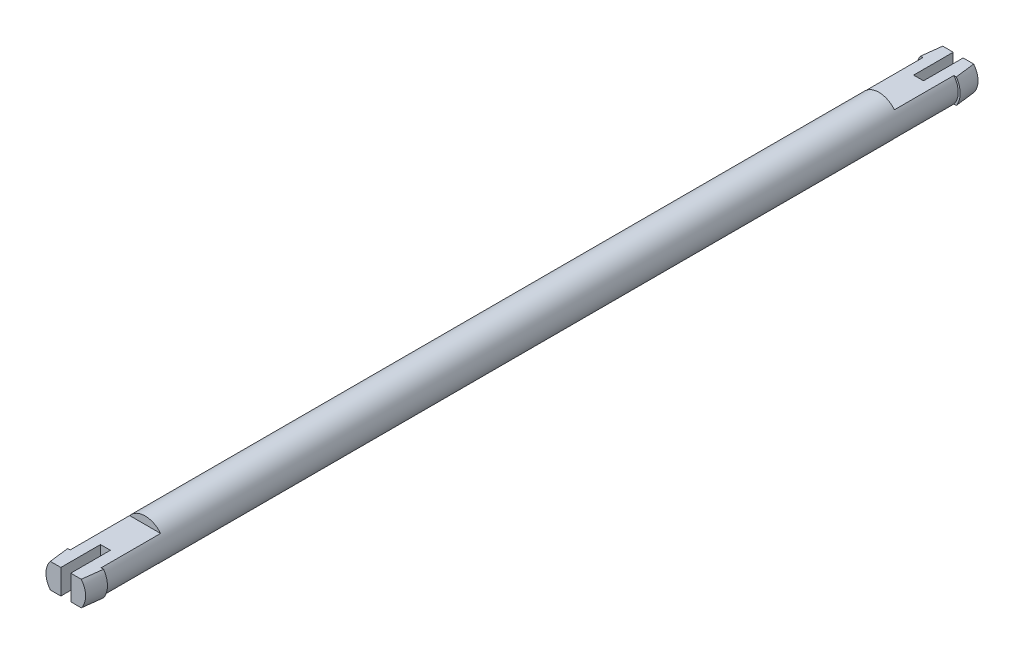
ISO-10303-21;
HEADER;
FILE_DESCRIPTION(('STEP AP214'),'2;1');
FILE_NAME('part.step','',(''),(''),'','','');
FILE_SCHEMA(('AUTOMOTIVE_DESIGN { 1 0 10303 214 1 1 1 1 }'));
ENDSEC;
DATA;
#1=APPLICATION_CONTEXT('core data for automotive mechanical design processes');
#2=APPLICATION_PROTOCOL_DEFINITION('international standard','automotive_design',2000,#1);
#3=PRODUCT_CONTEXT('',#1,'mechanical');
#4=PRODUCT('Part','Part','',(#3));
#5=PRODUCT_RELATED_PRODUCT_CATEGORY('part','',(#4));
#6=PRODUCT_DEFINITION_FORMATION('','',#4);
#7=PRODUCT_DEFINITION_CONTEXT('part definition',#1,'design');
#8=PRODUCT_DEFINITION('design','',#6,#7);
#9=PRODUCT_DEFINITION_SHAPE('','',#8);
#10=(LENGTH_UNIT() NAMED_UNIT(*) SI_UNIT(.MILLI.,.METRE.));
#11=(NAMED_UNIT(*) PLANE_ANGLE_UNIT() SI_UNIT($,.RADIAN.));
#12=(NAMED_UNIT(*) SI_UNIT($,.STERADIAN.) SOLID_ANGLE_UNIT());
#13=UNCERTAINTY_MEASURE_WITH_UNIT(LENGTH_MEASURE(1.E-05),#10,'distance_accuracy_value','');
#14=(GEOMETRIC_REPRESENTATION_CONTEXT(3) GLOBAL_UNCERTAINTY_ASSIGNED_CONTEXT((#13)) GLOBAL_UNIT_ASSIGNED_CONTEXT((#10,
#11,#12)) REPRESENTATION_CONTEXT('',''));
#15=CARTESIAN_POINT('',(0.,0.,0.));
#16=DIRECTION('',(0.,0.,1.));
#17=DIRECTION('',(1.,0.,0.));
#18=AXIS2_PLACEMENT_3D('',#15,#16,#17);
#19=CARTESIAN_POINT('',(0.,0.,-90.));
#20=DIRECTION('',(0.,0.,1.));
#21=DIRECTION('',(1.,0.,0.));
#22=AXIS2_PLACEMENT_3D('',#19,#20,#21);
#23=PLANE('',#22);
#24=DIRECTION('',(-1.,0.,0.));
#25=VECTOR('',#24,1.);
#26=CARTESIAN_POINT('',(0.,-1.25,-90.));
#27=LINE('',#26,#25);
#28=CARTESIAN_POINT('',(1.5612494995996,-1.25,-90.));
#29=VERTEX_POINT('',#28);
#30=CARTESIAN_POINT('',(0.499999999999999,-1.25,-90.));
#31=VERTEX_POINT('',#30);
#32=EDGE_CURVE('E213',#29,#31,#27,.T.);
#33=ORIENTED_EDGE('',*,*,#32,.T.);
#34=DIRECTION('',(0.,1.,0.));
#35=VECTOR('',#34,1.);
#36=CARTESIAN_POINT('',(0.499999999999999,-2.,-90.));
#37=LINE('',#36,#35);
#38=CARTESIAN_POINT('',(0.499999999999999,1.25,-90.));
#39=VERTEX_POINT('',#38);
#40=EDGE_CURVE('E199',#31,#39,#37,.T.);
#41=ORIENTED_EDGE('',*,*,#40,.T.);
#42=DIRECTION('',(1.,0.,0.));
#43=VECTOR('',#42,1.);
#44=CARTESIAN_POINT('',(0.,1.25,-90.));
#45=LINE('',#44,#43);
#46=CARTESIAN_POINT('',(1.5612494995996,1.25,-90.));
#47=VERTEX_POINT('',#46);
#48=EDGE_CURVE('E211',#39,#47,#45,.T.);
#49=ORIENTED_EDGE('',*,*,#48,.T.);
#50=CARTESIAN_POINT('',(0.,0.,-90.));
#51=DIRECTION('',(0.,0.,1.));
#52=DIRECTION('',(1.,0.,0.));
#53=AXIS2_PLACEMENT_3D('',#50,#51,#52);
#54=CIRCLE('',#53,2.);
#55=EDGE_CURVE('E416',#29,#47,#54,.T.);
#56=ORIENTED_EDGE('',*,*,#55,.F.);
#57=EDGE_LOOP('',(#33,#41,#49,#56));
#58=FACE_BOUND('',#57,.T.);
#59=ADVANCED_FACE('F34',(#58),#23,.F.);
#60=CARTESIAN_POINT('',(0.,0.,-88.));
#61=DIRECTION('',(0.,0.,1.));
#62=DIRECTION('',(1.,0.,0.));
#63=AXIS2_PLACEMENT_3D('',#60,#61,#62);
#64=PLANE('',#63);
#65=DIRECTION('',(-1.,0.,0.));
#66=VECTOR('',#65,1.);
#67=CARTESIAN_POINT('',(0.,-1.25,-88.));
#68=LINE('',#67,#66);
#69=CARTESIAN_POINT('',(1.81038669902327,-1.25,-88.0000000000001));
#70=VERTEX_POINT('',#69);
#71=CARTESIAN_POINT('',(1.5612494995996,-1.25,-88.));
#72=VERTEX_POINT('',#71);
#73=EDGE_CURVE('E261',#70,#72,#68,.T.);
#74=ORIENTED_EDGE('',*,*,#73,.F.);
#75=CARTESIAN_POINT('',(0.,0.,-88.));
#76=DIRECTION('',(0.,0.,1.));
#77=DIRECTION('',(1.,0.,0.));
#78=AXIS2_PLACEMENT_3D('',#75,#76,#77);
#79=CIRCLE('',#78,2.2);
#80=CARTESIAN_POINT('',(1.81038669902327,1.25,-88.0000000000001));
#81=VERTEX_POINT('',#80);
#82=EDGE_CURVE('E311',#70,#81,#79,.T.);
#83=ORIENTED_EDGE('',*,*,#82,.T.);
#84=DIRECTION('',(1.,0.,0.));
#85=VECTOR('',#84,1.);
#86=CARTESIAN_POINT('',(0.,1.25,-88.));
#87=LINE('',#86,#85);
#88=CARTESIAN_POINT('',(1.5612494995996,1.25,-88.));
#89=VERTEX_POINT('',#88);
#90=EDGE_CURVE('E294',#89,#81,#87,.T.);
#91=ORIENTED_EDGE('',*,*,#90,.F.);
#92=CARTESIAN_POINT('',(0.,0.,-88.));
#93=DIRECTION('',(0.,0.,1.));
#94=DIRECTION('',(1.,0.,0.));
#95=AXIS2_PLACEMENT_3D('',#92,#93,#94);
#96=CIRCLE('',#95,2.);
#97=EDGE_CURVE('E223',#89,#72,#96,.F.);
#98=ORIENTED_EDGE('',*,*,#97,.T.);
#99=EDGE_LOOP('',(#74,#83,#91,#98));
#100=FACE_BOUND('',#99,.T.);
#101=ADVANCED_FACE('F457',(#100),#64,.T.);
#102=CARTESIAN_POINT('',(0.,0.,-88.));
#103=DIRECTION('',(0.,0.,1.));
#104=DIRECTION('',(1.,0.,0.));
#105=AXIS2_PLACEMENT_3D('',#102,#103,#104);
#106=CONICAL_SURFACE('',#105,2.2,0.09966865249116);
#107=CARTESIAN_POINT('',(-2.07154781563105,-1.25,-85.8053511030935));
#108=CARTESIAN_POINT('',(-2.03550722726414,-1.25,-86.1139180179247));
#109=CARTESIAN_POINT('',(-1.99922295149764,-1.25,-86.4224563190549));
#110=CARTESIAN_POINT('',(-1.92607039278534,-1.25,-87.0394648246496));
#111=CARTESIAN_POINT('',(-1.88920210764817,-1.25,-87.3479350288541));
#112=CARTESIAN_POINT('',(-1.7775809143532,-1.25,-88.2731887554345));
#113=CARTESIAN_POINT('',(-1.70180760472734,-1.25,-88.889850372761));
#114=CARTESIAN_POINT('',(-1.58512147260779,-1.25,-89.8144760218349));
#115=CARTESIAN_POINT('',(-1.54572075887384,-1.25,-90.122630781761));
#116=CARTESIAN_POINT('',(-1.46564062998625,-1.25,-90.73877265943));
#117=CARTESIAN_POINT('',(-1.42496122188893,-1.25,-91.0467597780885));
#118=CARTESIAN_POINT('',(-1.34198072748193,-1.25,-91.6625339402322));
#119=CARTESIAN_POINT('',(-1.29967955336676,-1.25,-91.9703209719642));
#120=CARTESIAN_POINT('',(-1.21285635248197,-1.25,-92.5855868834585));
#121=CARTESIAN_POINT('',(-1.1683342833841,-1.25,-92.8930657572336));
#122=CARTESIAN_POINT('',(-1.12240193199715,-1.25,-93.2003390005902));
#123=B_SPLINE_CURVE_WITH_KNOTS('',3,(#107,#108,#109,#110,#111,#112,#113,#114,#115,#116,#117,
#118,#119,#120,#121,#122),.UNSPECIFIED.,.F.,.F.,(4,2,2,2,2,2,2,4),(0.,0.931993165762316,
1.86398982945298,3.72787750877082,4.65986577266914,5.59184889439996,6.52388254692389,
7.45593396996273),.UNSPECIFIED.);
#124=CARTESIAN_POINT('',(-1.81038669902327,-1.25,-88.0000000000001));
#125=VERTEX_POINT('',#124);
#126=CARTESIAN_POINT('',(-1.5612494995996,-1.25,-90.));
#127=VERTEX_POINT('',#126);
#128=EDGE_CURVE('E276',#125,#127,#123,.T.);
#129=ORIENTED_EDGE('',*,*,#128,.F.);
#130=CARTESIAN_POINT('',(-1.81038669902327,1.25,-88.0000000000001));
#131=VERTEX_POINT('',#130);
#132=EDGE_CURVE('E312',#131,#125,#79,.T.);
#133=ORIENTED_EDGE('',*,*,#132,.F.);
#134=CARTESIAN_POINT('',(-1.12240193199715,1.25,-93.2003390005902));
#135=CARTESIAN_POINT('',(-1.16007318188193,1.25,-92.9484550212629));
#136=CARTESIAN_POINT('',(-1.1967756822207,1.25,-92.6964288561933));
#137=CARTESIAN_POINT('',(-1.26860770564259,1.25,-92.1921552657798));
#138=CARTESIAN_POINT('',(-1.30373724824445,1.25,-91.9399078432212));
#139=CARTESIAN_POINT('',(-1.37278762127906,1.25,-91.4352571718187));
#140=CARTESIAN_POINT('',(-1.40670849276506,1.25,-91.1828539285641));
#141=CARTESIAN_POINT('',(-1.47357063225508,1.25,-90.6779171395039));
#142=CARTESIAN_POINT('',(-1.50651189747344,1.25,-90.4253835933298));
#143=CARTESIAN_POINT('',(-1.56766910496903,1.25,-89.9506559350624));
#144=CARTESIAN_POINT('',(-1.59597605442952,1.25,-89.7284735200067));
#145=CARTESIAN_POINT('',(-1.66291250795864,1.25,-89.1980433208731));
#146=CARTESIAN_POINT('',(-1.7012972858527,1.25,-88.8897646573885));
#147=CARTESIAN_POINT('',(-1.77723656698478,1.25,-88.2731045277542));
#148=CARTESIAN_POINT('',(-1.81479106820384,1.25,-87.9647230613564));
#149=CARTESIAN_POINT('',(-1.88921121609686,1.25,-87.3478817112025));
#150=CARTESIAN_POINT('',(-1.92607687286845,1.25,-87.0394218286632));
#151=CARTESIAN_POINT('',(-1.99922418459549,1.25,-86.4224342581659));
#152=CARTESIAN_POINT('',(-2.0355058422845,1.25,-86.1139065705321));
#153=CARTESIAN_POINT('',(-2.07154781563105,1.25,-85.8053511030935));
#154=B_SPLINE_CURVE_WITH_KNOTS('',3,(#134,#135,#136,#137,#138,#139,#140,#141,#142,#143,#144,
#145,#146,#147,#148,#149,#150,#151,#152,#153),.UNSPECIFIED.,.F.,.F.,(4,2,2,2,2,2,2,2,2,4),(0.,
0.764050536151596,1.5280915886214,2.2921066651918,3.05612391415671,3.72805834866274,
4.66003438385202,5.59201268506309,6.5239773138689,7.45593757911203),.UNSPECIFIED.);
#155=CARTESIAN_POINT('',(-1.5612494995996,1.25,-90.));
#156=VERTEX_POINT('',#155);
#157=EDGE_CURVE('E301',#156,#131,#154,.T.);
#158=ORIENTED_EDGE('',*,*,#157,.F.);
#159=EDGE_CURVE('E417',#156,#127,#54,.T.);
#160=ORIENTED_EDGE('',*,*,#159,.T.);
#161=EDGE_LOOP('',(#129,#133,#158,#160));
#162=FACE_BOUND('',#161,.T.);
#163=ADVANCED_FACE('F463',(#162),#106,.T.);
#164=CARTESIAN_POINT('',(0.,0.,0.));
#165=DIRECTION('',(0.,0.,1.));
#166=DIRECTION('',(1.,0.,0.));
#167=AXIS2_PLACEMENT_3D('',#164,#165,#166);
#168=PLANE('',#167);
#169=DIRECTION('',(0.,-1.,0.));
#170=VECTOR('',#169,1.);
#171=CARTESIAN_POINT('',(-0.5,2.001,0.));
#172=LINE('',#171,#170);
#173=CARTESIAN_POINT('',(-0.5,1.25,0.));
#174=VERTEX_POINT('',#173);
#175=CARTESIAN_POINT('',(-0.5,-1.25,0.));
#176=VERTEX_POINT('',#175);
#177=EDGE_CURVE('E328',#174,#176,#172,.T.);
#178=ORIENTED_EDGE('',*,*,#177,.F.);
#179=DIRECTION('',(1.,0.,0.));
#180=VECTOR('',#179,1.);
#181=CARTESIAN_POINT('',(0.,1.25,0.));
#182=LINE('',#181,#180);
#183=CARTESIAN_POINT('',(-1.5612494995996,1.25,0.));
#184=VERTEX_POINT('',#183);
#185=EDGE_CURVE('E431',#184,#174,#182,.T.);
#186=ORIENTED_EDGE('',*,*,#185,.F.);
#187=CARTESIAN_POINT('',(0.,0.,0.));
#188=DIRECTION('',(0.,0.,1.));
#189=DIRECTION('',(1.,0.,0.));
#190=AXIS2_PLACEMENT_3D('',#187,#188,#189);
#191=CIRCLE('',#190,2.);
#192=CARTESIAN_POINT('',(-1.5612494995996,-1.25,0.));
#193=VERTEX_POINT('',#192);
#194=EDGE_CURVE('E412',#184,#193,#191,.T.);
#195=ORIENTED_EDGE('',*,*,#194,.T.);
#196=DIRECTION('',(-1.,0.,0.));
#197=VECTOR('',#196,1.);
#198=CARTESIAN_POINT('',(0.,-1.25,0.));
#199=LINE('',#198,#197);
#200=EDGE_CURVE('E424',#176,#193,#199,.T.);
#201=ORIENTED_EDGE('',*,*,#200,.F.);
#202=EDGE_LOOP('',(#178,#186,#195,#201));
#203=FACE_BOUND('',#202,.T.);
#204=ADVANCED_FACE('F487',(#203),#168,.T.);
#205=CARTESIAN_POINT('',(0.,0.,0.));
#206=DIRECTION('',(0.,0.,-1.));
#207=DIRECTION('',(-1.,0.,0.));
#208=AXIS2_PLACEMENT_3D('',#205,#206,#207);
#209=CONICAL_SURFACE('',#208,2.,0.099668652491164);
#210=CARTESIAN_POINT('',(-2.20629085167545,1.25,-5.35787712366069));
#211=CARTESIAN_POINT('',(-2.16911364127437,1.25,-5.03442418142204));
#212=CARTESIAN_POINT('',(-2.13171451989949,1.25,-4.71099685663597));
#213=CARTESIAN_POINT('',(-2.05638780976398,1.25,-4.06420290953939));
#214=CARTESIAN_POINT('',(-2.01846021960566,1.25,-3.74083628739172));
#215=CARTESIAN_POINT('',(-1.9037610902439,1.25,-2.77086975377677));
#216=CARTESIAN_POINT('',(-1.82607027221003,1.25,-2.12437765306017));
#217=CARTESIAN_POINT('',(-1.70685435031514,1.25,-1.15495865945317));
#218=CARTESIAN_POINT('',(-1.6666684414073,1.25,-0.831867113806452));
#219=CARTESIAN_POINT('',(-1.58517894557185,1.25,-0.185825927060374));
#220=CARTESIAN_POINT('',(-1.54387536251855,1.25,0.13712371452694));
#221=CARTESIAN_POINT('',(-1.45986916908056,1.25,0.782854266012009));
#222=CARTESIAN_POINT('',(-1.41716650618306,1.25,1.10563516911334));
#223=CARTESIAN_POINT('',(-1.3298927063912,1.25,1.75094775860941));
#224=CARTESIAN_POINT('',(-1.28532154707355,1.25,2.07347944196601));
#225=CARTESIAN_POINT('',(-1.23958118370649,1.25,2.39584846975231));
#226=B_SPLINE_CURVE_WITH_KNOTS('',3,(#210,#211,#212,#213,#214,#215,#216,#217,#218,#219,#220,
#221,#222,#223,#224,#225),.UNSPECIFIED.,.F.,.F.,(4,2,2,2,2,2,2,4),(0.,0.976747065340101,
1.95349671443936,3.90691894725973,4.88366075798534,5.86039918335275,6.83717431153943,
7.81396116508771),.UNSPECIFIED.);
#227=CARTESIAN_POINT('',(-1.81038669902317,1.25,-2.));
#228=VERTEX_POINT('',#227);
#229=EDGE_CURVE('E344',#228,#184,#226,.T.);
#230=ORIENTED_EDGE('',*,*,#229,.F.);
#231=CARTESIAN_POINT('',(0.,0.,-2.));
#232=DIRECTION('',(0.,0.,1.));
#233=DIRECTION('',(1.,0.,0.));
#234=AXIS2_PLACEMENT_3D('',#231,#232,#233);
#235=CIRCLE('',#234,2.2);
#236=CARTESIAN_POINT('',(-1.81038669902317,-1.25,-2.));
#237=VERTEX_POINT('',#236);
#238=EDGE_CURVE('E408',#228,#237,#235,.T.);
#239=ORIENTED_EDGE('',*,*,#238,.T.);
#240=CARTESIAN_POINT('',(-1.23958118370649,-1.25,2.39584846975231));
#241=CARTESIAN_POINT('',(-1.27708445163934,-1.25,2.13162650097858));
#242=CARTESIAN_POINT('',(-1.31378723609278,-1.25,1.86729257599779));
#243=CARTESIAN_POINT('',(-1.38587498011764,-1.25,1.33844690886302));
#244=CARTESIAN_POINT('',(-1.42125994975575,-1.25,1.07393516808307));
#245=CARTESIAN_POINT('',(-1.49099498681417,-1.25,0.544781873474837));
#246=CARTESIAN_POINT('',(-1.52534507748139,-1.25,0.280140322698453));
#247=CARTESIAN_POINT('',(-1.59319606726224,-1.25,-0.249251984131471));
#248=CARTESIAN_POINT('',(-1.62669696491898,-1.25,-0.514002740371573));
#249=CARTESIAN_POINT('',(-1.68902097967955,-1.25,-1.01186777884924));
#250=CARTESIAN_POINT('',(-1.71792365975446,-1.25,-1.24497212268679));
#251=CARTESIAN_POINT('',(-1.82607281461731,-1.25,-2.1243927650584));
#252=CARTESIAN_POINT('',(-1.90376491575885,-1.25,-2.77090043818359));
#253=CARTESIAN_POINT('',(-2.01846468029957,-1.25,-3.74087483946421));
#254=CARTESIAN_POINT('',(-2.05639139314501,-1.25,-4.06423386196728));
#255=CARTESIAN_POINT('',(-2.13171635303437,-1.25,-4.71101241305846));
#256=CARTESIAN_POINT('',(-2.16911460179216,-1.25,-5.03443194144689));
#257=CARTESIAN_POINT('',(-2.20629085167545,-1.25,-5.35787712366069));
#258=B_SPLINE_CURVE_WITH_KNOTS('',3,(#240,#241,#242,#243,#244,#245,#246,#247,#248,#249,#250,
#251,#252,#253,#254,#255,#256,#257),.UNSPECIFIED.,.F.,.F.,(4,2,2,2,2,2,2,2,4),(0.,
0.800607232202043,1.60120834737587,2.40179146488675,3.20237595579527,3.90704351295181,
5.8605121791312,6.83723890380332,7.81396246011892),.UNSPECIFIED.);
#259=EDGE_CURVE('E399',#193,#237,#258,.T.);
#260=ORIENTED_EDGE('',*,*,#259,.F.);
#261=ORIENTED_EDGE('',*,*,#194,.F.);
#262=EDGE_LOOP('',(#230,#239,#260,#261));
#263=FACE_BOUND('',#262,.T.);
#264=ADVANCED_FACE('F491',(#263),#209,.T.);
#265=CARTESIAN_POINT('',(0.,0.,-2.));
#266=DIRECTION('',(0.,0.,-1.));
#267=DIRECTION('',(-1.,0.,0.));
#268=AXIS2_PLACEMENT_3D('',#265,#266,#267);
#269=PLANE('',#268);
#270=DIRECTION('',(-1.,0.,0.));
#271=VECTOR('',#270,1.);
#272=CARTESIAN_POINT('',(0.,1.25,-2.));
#273=LINE('',#272,#271);
#274=CARTESIAN_POINT('',(1.81038669902317,1.25,-2.));
#275=VERTEX_POINT('',#274);
#276=CARTESIAN_POINT('',(1.5612494995996,1.25,-2.));
#277=VERTEX_POINT('',#276);
#278=EDGE_CURVE('E345',#275,#277,#273,.T.);
#279=ORIENTED_EDGE('',*,*,#278,.F.);
#280=CARTESIAN_POINT('',(1.81038669902317,-1.25,-2.));
#281=VERTEX_POINT('',#280);
#282=EDGE_CURVE('E409',#281,#275,#235,.T.);
#283=ORIENTED_EDGE('',*,*,#282,.F.);
#284=DIRECTION('',(1.,0.,0.));
#285=VECTOR('',#284,1.);
#286=CARTESIAN_POINT('',(0.,-1.25,-2.));
#287=LINE('',#286,#285);
#288=CARTESIAN_POINT('',(1.5612494995996,-1.25,-2.));
#289=VERTEX_POINT('',#288);
#290=EDGE_CURVE('E381',#289,#281,#287,.T.);
#291=ORIENTED_EDGE('',*,*,#290,.F.);
#292=CARTESIAN_POINT('',(0.,0.,-2.));
#293=DIRECTION('',(0.,0.,-1.));
#294=DIRECTION('',(-1.,0.,0.));
#295=AXIS2_PLACEMENT_3D('',#292,#293,#294);
#296=CIRCLE('',#295,2.);
#297=EDGE_CURVE('E421',#289,#277,#296,.F.);
#298=ORIENTED_EDGE('',*,*,#297,.T.);
#299=EDGE_LOOP('',(#279,#283,#291,#298));
#300=FACE_BOUND('',#299,.T.);
#301=ADVANCED_FACE('F496',(#300),#269,.T.);
#302=CARTESIAN_POINT('',(0.,0.,-90.));
#303=DIRECTION('',(0.,0.,1.));
#304=DIRECTION('',(1.,0.,0.));
#305=AXIS2_PLACEMENT_3D('',#302,#303,#304);
#306=CYLINDRICAL_SURFACE('',#305,2.);
#307=DIRECTION('',(0.,0.,1.));
#308=VECTOR('',#307,1.);
#309=CARTESIAN_POINT('',(-1.5612494995996,-1.25,-90.));
#310=LINE('',#309,#308);
#311=CARTESIAN_POINT('',(-1.5612494995996,-1.25,-82.));
#312=VERTEX_POINT('',#311);
#313=CARTESIAN_POINT('',(-1.5612494995996,-1.25,-88.));
#314=VERTEX_POINT('',#313);
#315=EDGE_CURVE('E284',#312,#314,#310,.F.);
#316=ORIENTED_EDGE('',*,*,#315,.F.);
#317=CARTESIAN_POINT('',(0.,0.,-82.));
#318=DIRECTION('',(0.,0.,-1.));
#319=DIRECTION('',(-1.,0.,0.));
#320=AXIS2_PLACEMENT_3D('',#317,#318,#319);
#321=CIRCLE('',#320,2.);
#322=CARTESIAN_POINT('',(1.5612494995996,-1.25,-82.));
#323=VERTEX_POINT('',#322);
#324=EDGE_CURVE('E234',#312,#323,#321,.F.);
#325=ORIENTED_EDGE('',*,*,#324,.T.);
#326=DIRECTION('',(0.,0.,1.));
#327=VECTOR('',#326,1.);
#328=CARTESIAN_POINT('',(1.5612494995996,-1.25,-90.));
#329=LINE('',#328,#327);
#330=EDGE_CURVE('E283',#72,#323,#329,.T.);
#331=ORIENTED_EDGE('',*,*,#330,.F.);
#332=ORIENTED_EDGE('',*,*,#97,.F.);
#333=DIRECTION('',(0.,0.,1.));
#334=VECTOR('',#333,1.);
#335=CARTESIAN_POINT('',(1.5612494995996,1.25,-90.));
#336=LINE('',#335,#334);
#337=CARTESIAN_POINT('',(1.5612494995996,1.25,-82.));
#338=VERTEX_POINT('',#337);
#339=EDGE_CURVE('E308',#338,#89,#336,.F.);
#340=ORIENTED_EDGE('',*,*,#339,.F.);
#341=CARTESIAN_POINT('',(0.,0.,-82.));
#342=DIRECTION('',(0.,0.,1.));
#343=DIRECTION('',(1.,0.,0.));
#344=AXIS2_PLACEMENT_3D('',#341,#342,#343);
#345=CIRCLE('',#344,2.);
#346=CARTESIAN_POINT('',(-1.5612494995996,1.25,-82.));
#347=VERTEX_POINT('',#346);
#348=EDGE_CURVE('E226',#347,#338,#345,.F.);
#349=ORIENTED_EDGE('',*,*,#348,.F.);
#350=DIRECTION('',(0.,0.,1.));
#351=VECTOR('',#350,1.);
#352=CARTESIAN_POINT('',(-1.5612494995996,1.25,-90.));
#353=LINE('',#352,#351);
#354=CARTESIAN_POINT('',(-1.5612494995996,1.25,-88.));
#355=VERTEX_POINT('',#354);
#356=EDGE_CURVE('E309',#355,#347,#353,.T.);
#357=ORIENTED_EDGE('',*,*,#356,.F.);
#358=EDGE_CURVE('E228',#314,#355,#96,.F.);
#359=ORIENTED_EDGE('',*,*,#358,.F.);
#360=EDGE_LOOP('',(#316,#325,#331,#332,#340,#349,#357,#359));
#361=FACE_BOUND('',#360,.T.);
#362=DIRECTION('',(0.,0.,1.));
#363=VECTOR('',#362,1.);
#364=CARTESIAN_POINT('',(1.5612494995996,1.25,-90.));
#365=LINE('',#364,#363);
#366=CARTESIAN_POINT('',(1.5612494995996,1.25,-8.00000000000001));
#367=VERTEX_POINT('',#366);
#368=EDGE_CURVE('E376',#277,#367,#365,.F.);
#369=ORIENTED_EDGE('',*,*,#368,.F.);
#370=ORIENTED_EDGE('',*,*,#297,.F.);
#371=DIRECTION('',(0.,0.,1.));
#372=VECTOR('',#371,1.);
#373=CARTESIAN_POINT('',(1.5612494995996,-1.25,-90.));
#374=LINE('',#373,#372);
#375=CARTESIAN_POINT('',(1.5612494995996,-1.25,-8.00000000000001));
#376=VERTEX_POINT('',#375);
#377=EDGE_CURVE('E390',#376,#289,#374,.T.);
#378=ORIENTED_EDGE('',*,*,#377,.F.);
#379=CARTESIAN_POINT('',(0.,0.,-8.00000000000001));
#380=DIRECTION('',(0.,0.,-1.));
#381=DIRECTION('',(-1.,0.,0.));
#382=AXIS2_PLACEMENT_3D('',#379,#380,#381);
#383=CIRCLE('',#382,2.);
#384=CARTESIAN_POINT('',(-1.5612494995996,-1.25,-8.00000000000001));
#385=VERTEX_POINT('',#384);
#386=EDGE_CURVE('E428',#385,#376,#383,.F.);
#387=ORIENTED_EDGE('',*,*,#386,.F.);
#388=DIRECTION('',(0.,0.,1.));
#389=VECTOR('',#388,1.);
#390=CARTESIAN_POINT('',(-1.5612494995996,-1.25,-90.));
#391=LINE('',#390,#389);
#392=CARTESIAN_POINT('',(-1.5612494995996,-1.25,-2.));
#393=VERTEX_POINT('',#392);
#394=EDGE_CURVE('E406',#393,#385,#391,.F.);
#395=ORIENTED_EDGE('',*,*,#394,.F.);
#396=CARTESIAN_POINT('',(-1.5612494995996,1.25,-2.));
#397=VERTEX_POINT('',#396);
#398=EDGE_CURVE('E420',#397,#393,#296,.F.);
#399=ORIENTED_EDGE('',*,*,#398,.F.);
#400=DIRECTION('',(0.,0.,1.));
#401=VECTOR('',#400,1.);
#402=CARTESIAN_POINT('',(-1.5612494995996,1.25,-90.));
#403=LINE('',#402,#401);
#404=CARTESIAN_POINT('',(-1.5612494995996,1.25,-8.00000000000001));
#405=VERTEX_POINT('',#404);
#406=EDGE_CURVE('E353',#405,#397,#403,.T.);
#407=ORIENTED_EDGE('',*,*,#406,.F.);
#408=CARTESIAN_POINT('',(0.,0.,-8.00000000000001));
#409=DIRECTION('',(0.,0.,-1.));
#410=DIRECTION('',(-1.,0.,0.));
#411=AXIS2_PLACEMENT_3D('',#408,#409,#410);
#412=CIRCLE('',#411,2.);
#413=EDGE_CURVE('E433',#367,#405,#412,.F.);
#414=ORIENTED_EDGE('',*,*,#413,.F.);
#415=EDGE_LOOP('',(#369,#370,#378,#387,#395,#399,#407,#414));
#416=FACE_BOUND('',#415,.T.);
#417=ADVANCED_FACE('F36',(#361,#416),#306,.T.);
#418=CARTESIAN_POINT('',(1.23958118370649,1.25,2.39584846975231));
#419=CARTESIAN_POINT('',(1.27708445163934,1.25,2.13162650097858));
#420=CARTESIAN_POINT('',(1.31378723609278,1.25,1.86729257599779));
#421=CARTESIAN_POINT('',(1.38587498011764,1.25,1.33844690886302));
#422=CARTESIAN_POINT('',(1.42125994975575,1.25,1.07393516808307));
#423=CARTESIAN_POINT('',(1.49099498681417,1.25,0.544781873474837));
#424=CARTESIAN_POINT('',(1.52534507748139,1.25,0.280140322698453));
#425=CARTESIAN_POINT('',(1.59319606726224,1.25,-0.249251984131471));
#426=CARTESIAN_POINT('',(1.62669696491898,1.25,-0.514002740371573));
#427=CARTESIAN_POINT('',(1.68902097967955,1.25,-1.01186777884924));
#428=CARTESIAN_POINT('',(1.71792365975446,1.25,-1.24497212268679));
#429=CARTESIAN_POINT('',(1.82607281461731,1.25,-2.1243927650584));
#430=CARTESIAN_POINT('',(1.90376491575885,1.25,-2.77090043818359));
#431=CARTESIAN_POINT('',(2.01846468029957,1.25,-3.74087483946421));
#432=CARTESIAN_POINT('',(2.05639139314501,1.25,-4.06423386196728));
#433=CARTESIAN_POINT('',(2.13171635303437,1.25,-4.71101241305846));
#434=CARTESIAN_POINT('',(2.16911460179216,1.25,-5.03443194144689));
#435=CARTESIAN_POINT('',(2.20629085167545,1.25,-5.35787712366069));
#436=B_SPLINE_CURVE_WITH_KNOTS('',3,(#418,#419,#420,#421,#422,#423,#424,#425,#426,#427,#428,
#429,#430,#431,#432,#433,#434,#435),.UNSPECIFIED.,.F.,.F.,(4,2,2,2,2,2,2,2,4),(0.,
0.800607232202043,1.60120834737587,2.40179146488675,3.20237595579527,3.90704351295181,
5.8605121791312,6.83723890380332,7.81396246011892),.UNSPECIFIED.);
#437=CARTESIAN_POINT('',(1.5612494995996,1.25,0.));
#438=VERTEX_POINT('',#437);
#439=EDGE_CURVE('E370',#438,#275,#436,.T.);
#440=ORIENTED_EDGE('',*,*,#439,.F.);
#441=CARTESIAN_POINT('',(1.5612494995996,-1.25,0.));
#442=VERTEX_POINT('',#441);
#443=EDGE_CURVE('E413',#442,#438,#191,.T.);
#444=ORIENTED_EDGE('',*,*,#443,.F.);
#445=CARTESIAN_POINT('',(2.20629085167545,-1.25,-5.35787712366069));
#446=CARTESIAN_POINT('',(2.16911364127437,-1.25,-5.03442418142204));
#447=CARTESIAN_POINT('',(2.13171451989949,-1.25,-4.71099685663597));
#448=CARTESIAN_POINT('',(2.05638780976398,-1.25,-4.06420290953939));
#449=CARTESIAN_POINT('',(2.01846021960566,-1.25,-3.74083628739172));
#450=CARTESIAN_POINT('',(1.9037610902439,-1.25,-2.77086975377677));
#451=CARTESIAN_POINT('',(1.82607027221003,-1.25,-2.12437765306017));
#452=CARTESIAN_POINT('',(1.70685435031514,-1.25,-1.15495865945317));
#453=CARTESIAN_POINT('',(1.6666684414073,-1.25,-0.831867113806452));
#454=CARTESIAN_POINT('',(1.58517894557185,-1.25,-0.185825927060374));
#455=CARTESIAN_POINT('',(1.54387536251855,-1.25,0.13712371452694));
#456=CARTESIAN_POINT('',(1.45986916908056,-1.25,0.782854266012009));
#457=CARTESIAN_POINT('',(1.41716650618306,-1.25,1.10563516911334));
#458=CARTESIAN_POINT('',(1.3298927063912,-1.25,1.75094775860941));
#459=CARTESIAN_POINT('',(1.28532154707355,-1.25,2.07347944196601));
#460=CARTESIAN_POINT('',(1.23958118370649,-1.25,2.39584846975231));
#461=B_SPLINE_CURVE_WITH_KNOTS('',3,(#445,#446,#447,#448,#449,#450,#451,#452,#453,#454,#455,
#456,#457,#458,#459,#460),.UNSPECIFIED.,.F.,.F.,(4,2,2,2,2,2,2,4),(0.,0.976747065340101,
1.95349671443936,3.90691894725973,4.88366075798534,5.86039918335275,6.83717431153943,
7.81396116508771),.UNSPECIFIED.);
#462=EDGE_CURVE('E383',#281,#442,#461,.T.);
#463=ORIENTED_EDGE('',*,*,#462,.F.);
#464=ORIENTED_EDGE('',*,*,#282,.T.);
#465=EDGE_LOOP('',(#440,#444,#463,#464));
#466=FACE_BOUND('',#465,.T.);
#467=ADVANCED_FACE('F355',(#466),#209,.T.);
#468=EDGE_CURVE('E342',#397,#228,#273,.T.);
#469=ORIENTED_EDGE('',*,*,#468,.F.);
#470=ORIENTED_EDGE('',*,*,#398,.T.);
#471=EDGE_CURVE('E384',#237,#393,#287,.T.);
#472=ORIENTED_EDGE('',*,*,#471,.F.);
#473=ORIENTED_EDGE('',*,*,#238,.F.);
#474=EDGE_LOOP('',(#469,#470,#472,#473));
#475=FACE_BOUND('',#474,.T.);
#476=ADVANCED_FACE('F397',(#475),#269,.T.);
#477=DIRECTION('',(0.,-1.,0.));
#478=VECTOR('',#477,1.);
#479=CARTESIAN_POINT('',(0.5,2.001,0.));
#480=LINE('',#479,#478);
#481=CARTESIAN_POINT('',(0.5,1.25,0.));
#482=VERTEX_POINT('',#481);
#483=CARTESIAN_POINT('',(0.5,-1.25,0.));
#484=VERTEX_POINT('',#483);
#485=EDGE_CURVE('E331',#482,#484,#480,.T.);
#486=ORIENTED_EDGE('',*,*,#485,.T.);
#487=EDGE_CURVE('E425',#442,#484,#199,.T.);
#488=ORIENTED_EDGE('',*,*,#487,.F.);
#489=ORIENTED_EDGE('',*,*,#443,.T.);
#490=EDGE_CURVE('E430',#482,#438,#182,.T.);
#491=ORIENTED_EDGE('',*,*,#490,.F.);
#492=EDGE_LOOP('',(#486,#488,#489,#491));
#493=FACE_BOUND('',#492,.T.);
#494=ADVANCED_FACE('F395',(#493),#168,.T.);
#495=CARTESIAN_POINT('',(-2.1,-1.25,-8.));
#496=DIRECTION('',(0.,1.,0.));
#497=DIRECTION('',(0.,0.,1.));
#498=AXIS2_PLACEMENT_3D('',#495,#496,#497);
#499=PLANE('',#498);
#500=DIRECTION('',(1.,0.,0.));
#501=VECTOR('',#500,1.);
#502=CARTESIAN_POINT('',(-0.499999999999999,-1.25,-4.00000000000006));
#503=LINE('',#502,#501);
#504=CARTESIAN_POINT('',(-0.499999999999999,-1.25,-4.00000000000006));
#505=VERTEX_POINT('',#504);
#506=CARTESIAN_POINT('',(0.5,-1.25,-4.00000000000006));
#507=VERTEX_POINT('',#506);
#508=EDGE_CURVE('E322',#505,#507,#503,.T.);
#509=ORIENTED_EDGE('',*,*,#508,.F.);
#510=DIRECTION('',(0.,0.,-1.));
#511=VECTOR('',#510,1.);
#512=CARTESIAN_POINT('',(-0.5,-1.25,0.));
#513=LINE('',#512,#511);
#514=EDGE_CURVE('E319',#176,#505,#513,.T.);
#515=ORIENTED_EDGE('',*,*,#514,.F.);
#516=ORIENTED_EDGE('',*,*,#200,.T.);
#517=ORIENTED_EDGE('',*,*,#259,.T.);
#518=ORIENTED_EDGE('',*,*,#471,.T.);
#519=ORIENTED_EDGE('',*,*,#394,.T.);
#520=DIRECTION('',(-1.,0.,0.));
#521=VECTOR('',#520,1.);
#522=CARTESIAN_POINT('',(-2.1,-1.25,-8.));
#523=LINE('',#522,#521);
#524=EDGE_CURVE('E378',#376,#385,#523,.T.);
#525=ORIENTED_EDGE('',*,*,#524,.F.);
#526=ORIENTED_EDGE('',*,*,#377,.T.);
#527=ORIENTED_EDGE('',*,*,#290,.T.);
#528=ORIENTED_EDGE('',*,*,#462,.T.);
#529=ORIENTED_EDGE('',*,*,#487,.T.);
#530=DIRECTION('',(0.,0.,1.));
#531=VECTOR('',#530,1.);
#532=CARTESIAN_POINT('',(0.5,-1.25,0.));
#533=LINE('',#532,#531);
#534=EDGE_CURVE('E325',#507,#484,#533,.T.);
#535=ORIENTED_EDGE('',*,*,#534,.F.);
#536=EDGE_LOOP('',(#509,#515,#516,#517,#518,#519,#525,#526,#527,#528,#529,#535));
#537=FACE_BOUND('',#536,.T.);
#538=ADVANCED_FACE('F392',(#537),#499,.F.);
#539=CARTESIAN_POINT('',(-2.1,-1.25,-8.));
#540=DIRECTION('',(0.,0.,-1.));
#541=DIRECTION('',(-1.,0.,0.));
#542=AXIS2_PLACEMENT_3D('',#539,#540,#541);
#543=PLANE('',#542);
#544=ORIENTED_EDGE('',*,*,#386,.T.);
#545=ORIENTED_EDGE('',*,*,#524,.T.);
#546=EDGE_LOOP('',(#544,#545));
#547=FACE_BOUND('',#546,.T.);
#548=ADVANCED_FACE('F365',(#547),#543,.F.);
#549=CARTESIAN_POINT('',(-2.1,1.25,-8.));
#550=DIRECTION('',(0.,-1.,0.));
#551=DIRECTION('',(0.,0.,-1.));
#552=AXIS2_PLACEMENT_3D('',#549,#550,#551);
#553=PLANE('',#552);
#554=ORIENTED_EDGE('',*,*,#185,.T.);
#555=DIRECTION('',(0.,0.,1.));
#556=VECTOR('',#555,1.);
#557=CARTESIAN_POINT('',(-0.5,1.25,0.));
#558=LINE('',#557,#556);
#559=CARTESIAN_POINT('',(-0.499999999999999,1.25,-4.00000000000006));
#560=VERTEX_POINT('',#559);
#561=EDGE_CURVE('E317',#560,#174,#558,.T.);
#562=ORIENTED_EDGE('',*,*,#561,.F.);
#563=DIRECTION('',(-1.,0.,0.));
#564=VECTOR('',#563,1.);
#565=CARTESIAN_POINT('',(-0.499999999999999,1.25,-4.00000000000006));
#566=LINE('',#565,#564);
#567=CARTESIAN_POINT('',(0.5,1.25,-4.00000000000006));
#568=VERTEX_POINT('',#567);
#569=EDGE_CURVE('E330',#568,#560,#566,.T.);
#570=ORIENTED_EDGE('',*,*,#569,.F.);
#571=DIRECTION('',(0.,0.,-1.));
#572=VECTOR('',#571,1.);
#573=CARTESIAN_POINT('',(0.5,1.25,0.));
#574=LINE('',#573,#572);
#575=EDGE_CURVE('E315',#482,#568,#574,.T.);
#576=ORIENTED_EDGE('',*,*,#575,.F.);
#577=ORIENTED_EDGE('',*,*,#490,.T.);
#578=ORIENTED_EDGE('',*,*,#439,.T.);
#579=ORIENTED_EDGE('',*,*,#278,.T.);
#580=ORIENTED_EDGE('',*,*,#368,.T.);
#581=DIRECTION('',(1.,0.,0.));
#582=VECTOR('',#581,1.);
#583=CARTESIAN_POINT('',(-2.1,1.25,-8.));
#584=LINE('',#583,#582);
#585=EDGE_CURVE('E339',#405,#367,#584,.T.);
#586=ORIENTED_EDGE('',*,*,#585,.F.);
#587=ORIENTED_EDGE('',*,*,#406,.T.);
#588=ORIENTED_EDGE('',*,*,#468,.T.);
#589=ORIENTED_EDGE('',*,*,#229,.T.);
#590=EDGE_LOOP('',(#554,#562,#570,#576,#577,#578,#579,#580,#586,#587,#588,#589));
#591=FACE_BOUND('',#590,.T.);
#592=ADVANCED_FACE('F359',(#591),#553,.F.);
#593=CARTESIAN_POINT('',(2.1,2.25,-8.));
#594=DIRECTION('',(0.,0.,-1.));
#595=DIRECTION('',(-1.,0.,0.));
#596=AXIS2_PLACEMENT_3D('',#593,#594,#595);
#597=PLANE('',#596);
#598=ORIENTED_EDGE('',*,*,#413,.T.);
#599=ORIENTED_EDGE('',*,*,#585,.T.);
#600=EDGE_LOOP('',(#598,#599));
#601=FACE_BOUND('',#600,.T.);
#602=ADVANCED_FACE('F364',(#601),#597,.F.);
#603=CARTESIAN_POINT('',(-0.5,2.001,0.));
#604=DIRECTION('',(-1.,0.,0.));
#605=DIRECTION('',(0.,0.,1.));
#606=AXIS2_PLACEMENT_3D('',#603,#604,#605);
#607=PLANE('',#606);
#608=ORIENTED_EDGE('',*,*,#561,.T.);
#609=ORIENTED_EDGE('',*,*,#177,.T.);
#610=ORIENTED_EDGE('',*,*,#514,.T.);
#611=DIRECTION('',(0.,-1.,0.));
#612=VECTOR('',#611,1.);
#613=CARTESIAN_POINT('',(-0.499999999999999,2.001,-4.00000000000006));
#614=LINE('',#613,#612);
#615=EDGE_CURVE('E327',#560,#505,#614,.T.);
#616=ORIENTED_EDGE('',*,*,#615,.F.);
#617=EDGE_LOOP('',(#608,#609,#610,#616));
#618=FACE_BOUND('',#617,.T.);
#619=ADVANCED_FACE('F550',(#618),#607,.F.);
#620=CARTESIAN_POINT('',(0.5,2.001,0.));
#621=DIRECTION('',(1.,0.,0.));
#622=DIRECTION('',(0.,0.,-1.));
#623=AXIS2_PLACEMENT_3D('',#620,#621,#622);
#624=PLANE('',#623);
#625=ORIENTED_EDGE('',*,*,#575,.T.);
#626=DIRECTION('',(0.,-1.,0.));
#627=VECTOR('',#626,1.);
#628=CARTESIAN_POINT('',(0.5,2.001,-4.00000000000006));
#629=LINE('',#628,#627);
#630=EDGE_CURVE('E334',#568,#507,#629,.T.);
#631=ORIENTED_EDGE('',*,*,#630,.T.);
#632=ORIENTED_EDGE('',*,*,#534,.T.);
#633=ORIENTED_EDGE('',*,*,#485,.F.);
#634=EDGE_LOOP('',(#625,#631,#632,#633));
#635=FACE_BOUND('',#634,.T.);
#636=ADVANCED_FACE('F555',(#635),#624,.F.);
#637=CARTESIAN_POINT('',(-0.499999999999999,2.001,-4.00000000000006));
#638=DIRECTION('',(0.,0.,-1.));
#639=DIRECTION('',(-1.,0.,0.));
#640=AXIS2_PLACEMENT_3D('',#637,#638,#639);
#641=PLANE('',#640);
#642=ORIENTED_EDGE('',*,*,#569,.T.);
#643=ORIENTED_EDGE('',*,*,#615,.T.);
#644=ORIENTED_EDGE('',*,*,#508,.T.);
#645=ORIENTED_EDGE('',*,*,#630,.F.);
#646=EDGE_LOOP('',(#642,#643,#644,#645));
#647=FACE_BOUND('',#646,.T.);
#648=ADVANCED_FACE('F484',(#647),#641,.F.);
#649=EDGE_CURVE('E282',#314,#125,#68,.T.);
#650=ORIENTED_EDGE('',*,*,#649,.F.);
#651=ORIENTED_EDGE('',*,*,#358,.T.);
#652=EDGE_CURVE('E307',#131,#355,#87,.T.);
#653=ORIENTED_EDGE('',*,*,#652,.F.);
#654=ORIENTED_EDGE('',*,*,#132,.T.);
#655=EDGE_LOOP('',(#650,#651,#653,#654));
#656=FACE_BOUND('',#655,.T.);
#657=ADVANCED_FACE('F442',(#656),#64,.T.);
#658=CARTESIAN_POINT('',(1.12240193199715,-1.25,-93.2003390005902));
#659=CARTESIAN_POINT('',(1.16007318188193,-1.25,-92.9484550212629));
#660=CARTESIAN_POINT('',(1.19677568222069,-1.25,-92.6964288561933));
#661=CARTESIAN_POINT('',(1.26860770564259,-1.25,-92.1921552657798));
#662=CARTESIAN_POINT('',(1.30373724824444,-1.25,-91.9399078432212));
#663=CARTESIAN_POINT('',(1.37278762127905,-1.25,-91.4352571718187));
#664=CARTESIAN_POINT('',(1.40670849276505,-1.25,-91.1828539285641));
#665=CARTESIAN_POINT('',(1.47357063225507,-1.25,-90.6779171395039));
#666=CARTESIAN_POINT('',(1.50651189747343,-1.25,-90.4253835933298));
#667=CARTESIAN_POINT('',(1.56766910496902,-1.25,-89.9506559350624));
#668=CARTESIAN_POINT('',(1.59597605442952,-1.25,-89.7284735200067));
#669=CARTESIAN_POINT('',(1.66291250795864,-1.25,-89.1980433208731));
#670=CARTESIAN_POINT('',(1.70129728585269,-1.25,-88.8897646573885));
#671=CARTESIAN_POINT('',(1.77723656698478,-1.25,-88.2731045277542));
#672=CARTESIAN_POINT('',(1.81479106820384,-1.25,-87.9647230613564));
#673=CARTESIAN_POINT('',(1.88921121609686,-1.25,-87.3478817112025));
#674=CARTESIAN_POINT('',(1.92607687286844,-1.25,-87.0394218286632));
#675=CARTESIAN_POINT('',(1.99922418459548,-1.25,-86.4224342581659));
#676=CARTESIAN_POINT('',(2.0355058422845,-1.25,-86.1139065705321));
#677=CARTESIAN_POINT('',(2.07154781563105,-1.25,-85.8053511030935));
#678=B_SPLINE_CURVE_WITH_KNOTS('',3,(#658,#659,#660,#661,#662,#663,#664,#665,#666,#667,#668,
#669,#670,#671,#672,#673,#674,#675,#676,#677),.UNSPECIFIED.,.F.,.F.,(4,2,2,2,2,2,2,2,2,4),(0.,
0.764050536151596,1.52809158862139,2.29210666519176,3.05612391415671,3.72805834866274,
4.66003438385202,5.59201268506309,6.5239773138689,7.45593757911203),.UNSPECIFIED.);
#679=EDGE_CURVE('E247',#29,#70,#678,.T.);
#680=ORIENTED_EDGE('',*,*,#679,.F.);
#681=ORIENTED_EDGE('',*,*,#55,.T.);
#682=CARTESIAN_POINT('',(2.07154781563105,1.25,-85.8053511030935));
#683=CARTESIAN_POINT('',(2.03550722726414,1.25,-86.1139180179247));
#684=CARTESIAN_POINT('',(1.99922295149764,1.25,-86.4224563190549));
#685=CARTESIAN_POINT('',(1.92607039278533,1.25,-87.0394648246496));
#686=CARTESIAN_POINT('',(1.88920210764817,1.25,-87.3479350288541));
#687=CARTESIAN_POINT('',(1.77758091435319,1.25,-88.2731887554345));
#688=CARTESIAN_POINT('',(1.70180760472733,1.25,-88.889850372761));
#689=CARTESIAN_POINT('',(1.58512147260778,1.25,-89.8144760218349));
#690=CARTESIAN_POINT('',(1.54572075887383,1.25,-90.122630781761));
#691=CARTESIAN_POINT('',(1.46564062998624,1.25,-90.73877265943));
#692=CARTESIAN_POINT('',(1.42496122188892,1.25,-91.0467597780886));
#693=CARTESIAN_POINT('',(1.34198072748193,1.25,-91.6625339402322));
#694=CARTESIAN_POINT('',(1.29967955336675,1.25,-91.9703209719642));
#695=CARTESIAN_POINT('',(1.21285635248197,1.25,-92.5855868834585));
#696=CARTESIAN_POINT('',(1.1683342833841,1.25,-92.8930657572336));
#697=CARTESIAN_POINT('',(1.12240193199715,1.25,-93.2003390005902));
#698=B_SPLINE_CURVE_WITH_KNOTS('',3,(#682,#683,#684,#685,#686,#687,#688,#689,#690,#691,#692,
#693,#694,#695,#696,#697),.UNSPECIFIED.,.F.,.F.,(4,2,2,2,2,2,2,4),(0.,0.931993165762316,
1.86398982945298,3.72787750877082,4.65986577266916,5.59184889439996,6.52388254692389,
7.45593396996273),.UNSPECIFIED.);
#699=EDGE_CURVE('E221',#81,#47,#698,.T.);
#700=ORIENTED_EDGE('',*,*,#699,.F.);
#701=ORIENTED_EDGE('',*,*,#82,.F.);
#702=EDGE_LOOP('',(#680,#681,#700,#701));
#703=FACE_BOUND('',#702,.T.);
#704=ADVANCED_FACE('F263',(#703),#106,.T.);
#705=CARTESIAN_POINT('',(-0.500000000000002,1.25,-90.));
#706=VERTEX_POINT('',#705);
#707=EDGE_CURVE('E222',#156,#706,#45,.T.);
#708=ORIENTED_EDGE('',*,*,#707,.T.);
#709=DIRECTION('',(0.,1.,0.));
#710=VECTOR('',#709,1.);
#711=CARTESIAN_POINT('',(-0.500000000000002,-2.,-90.));
#712=LINE('',#711,#710);
#713=CARTESIAN_POINT('',(-0.500000000000002,-1.25,-90.));
#714=VERTEX_POINT('',#713);
#715=EDGE_CURVE('E214',#714,#706,#712,.T.);
#716=ORIENTED_EDGE('',*,*,#715,.F.);
#717=EDGE_CURVE('E57',#714,#127,#27,.T.);
#718=ORIENTED_EDGE('',*,*,#717,.T.);
#719=ORIENTED_EDGE('',*,*,#159,.F.);
#720=EDGE_LOOP('',(#708,#716,#718,#719));
#721=FACE_BOUND('',#720,.T.);
#722=ADVANCED_FACE('F298',(#721),#23,.F.);
#723=CARTESIAN_POINT('',(2.1,1.25,-82.));
#724=DIRECTION('',(0.,-1.,0.));
#725=DIRECTION('',(0.,0.,-1.));
#726=AXIS2_PLACEMENT_3D('',#723,#724,#725);
#727=PLANE('',#726);
#728=ORIENTED_EDGE('',*,*,#48,.F.);
#729=DIRECTION('',(0.,0.,-1.));
#730=VECTOR('',#729,1.);
#731=CARTESIAN_POINT('',(0.499999999999999,1.25,-86.));
#732=LINE('',#731,#730);
#733=CARTESIAN_POINT('',(0.499999999999999,1.25,-86.));
#734=VERTEX_POINT('',#733);
#735=EDGE_CURVE('E196',#734,#39,#732,.T.);
#736=ORIENTED_EDGE('',*,*,#735,.F.);
#737=DIRECTION('',(1.,0.,0.));
#738=VECTOR('',#737,1.);
#739=CARTESIAN_POINT('',(-0.500000000000001,1.25,-86.));
#740=LINE('',#739,#738);
#741=CARTESIAN_POINT('',(-0.500000000000001,1.25,-86.));
#742=VERTEX_POINT('',#741);
#743=EDGE_CURVE('E215',#742,#734,#740,.T.);
#744=ORIENTED_EDGE('',*,*,#743,.F.);
#745=DIRECTION('',(0.,0.,1.));
#746=VECTOR('',#745,1.);
#747=CARTESIAN_POINT('',(-0.500000000000001,1.25,-86.));
#748=LINE('',#747,#746);
#749=EDGE_CURVE('E206',#706,#742,#748,.T.);
#750=ORIENTED_EDGE('',*,*,#749,.F.);
#751=ORIENTED_EDGE('',*,*,#707,.F.);
#752=ORIENTED_EDGE('',*,*,#157,.T.);
#753=ORIENTED_EDGE('',*,*,#652,.T.);
#754=ORIENTED_EDGE('',*,*,#356,.T.);
#755=DIRECTION('',(-1.,0.,0.));
#756=VECTOR('',#755,1.);
#757=CARTESIAN_POINT('',(2.1,1.25,-82.));
#758=LINE('',#757,#756);
#759=EDGE_CURVE('E286',#338,#347,#758,.T.);
#760=ORIENTED_EDGE('',*,*,#759,.F.);
#761=ORIENTED_EDGE('',*,*,#339,.T.);
#762=ORIENTED_EDGE('',*,*,#90,.T.);
#763=ORIENTED_EDGE('',*,*,#699,.T.);
#764=EDGE_LOOP('',(#728,#736,#744,#750,#751,#752,#753,#754,#760,#761,#762,#763));
#765=FACE_BOUND('',#764,.T.);
#766=ADVANCED_FACE('F218',(#765),#727,.F.);
#767=CARTESIAN_POINT('',(2.1,2.25,-82.));
#768=DIRECTION('',(0.,0.,1.));
#769=DIRECTION('',(1.,0.,0.));
#770=AXIS2_PLACEMENT_3D('',#767,#768,#769);
#771=PLANE('',#770);
#772=ORIENTED_EDGE('',*,*,#348,.T.);
#773=ORIENTED_EDGE('',*,*,#759,.T.);
#774=EDGE_LOOP('',(#772,#773));
#775=FACE_BOUND('',#774,.T.);
#776=ADVANCED_FACE('F272',(#775),#771,.F.);
#777=CARTESIAN_POINT('',(2.1,-1.25,-82.));
#778=DIRECTION('',(0.,1.,0.));
#779=DIRECTION('',(0.,0.,1.));
#780=AXIS2_PLACEMENT_3D('',#777,#778,#779);
#781=PLANE('',#780);
#782=DIRECTION('',(1.,0.,0.));
#783=VECTOR('',#782,1.);
#784=CARTESIAN_POINT('',(2.1,-1.25,-86.));
#785=LINE('',#784,#783);
#786=CARTESIAN_POINT('',(-0.500000000000001,-1.25,-86.));
#787=VERTEX_POINT('',#786);
#788=CARTESIAN_POINT('',(0.499999999999999,-1.25,-86.));
#789=VERTEX_POINT('',#788);
#790=EDGE_CURVE('E42',#787,#789,#785,.T.);
#791=ORIENTED_EDGE('',*,*,#790,.T.);
#792=DIRECTION('',(0.,0.,-1.));
#793=VECTOR('',#792,1.);
#794=CARTESIAN_POINT('',(0.499999999999999,-1.25,-82.));
#795=LINE('',#794,#793);
#796=EDGE_CURVE('E11',#789,#31,#795,.T.);
#797=ORIENTED_EDGE('',*,*,#796,.T.);
#798=ORIENTED_EDGE('',*,*,#32,.F.);
#799=ORIENTED_EDGE('',*,*,#679,.T.);
#800=ORIENTED_EDGE('',*,*,#73,.T.);
#801=ORIENTED_EDGE('',*,*,#330,.T.);
#802=DIRECTION('',(1.,0.,0.));
#803=VECTOR('',#802,1.);
#804=CARTESIAN_POINT('',(2.1,-1.25,-82.));
#805=LINE('',#804,#803);
#806=EDGE_CURVE('E244',#312,#323,#805,.T.);
#807=ORIENTED_EDGE('',*,*,#806,.F.);
#808=ORIENTED_EDGE('',*,*,#315,.T.);
#809=ORIENTED_EDGE('',*,*,#649,.T.);
#810=ORIENTED_EDGE('',*,*,#128,.T.);
#811=ORIENTED_EDGE('',*,*,#717,.F.);
#812=DIRECTION('',(0.,0.,1.));
#813=VECTOR('',#812,1.);
#814=CARTESIAN_POINT('',(-0.5,-1.25,-82.));
#815=LINE('',#814,#813);
#816=EDGE_CURVE('E237',#714,#787,#815,.T.);
#817=ORIENTED_EDGE('',*,*,#816,.T.);
#818=EDGE_LOOP('',(#791,#797,#798,#799,#800,#801,#807,#808,#809,#810,#811,#817));
#819=FACE_BOUND('',#818,.T.);
#820=ADVANCED_FACE('F241',(#819),#781,.F.);
#821=CARTESIAN_POINT('',(2.1,-2.25,-82.));
#822=DIRECTION('',(0.,0.,-1.));
#823=DIRECTION('',(-1.,0.,0.));
#824=AXIS2_PLACEMENT_3D('',#821,#822,#823);
#825=PLANE('',#824);
#826=ORIENTED_EDGE('',*,*,#806,.T.);
#827=ORIENTED_EDGE('',*,*,#324,.F.);
#828=EDGE_LOOP('',(#826,#827));
#829=FACE_BOUND('',#828,.T.);
#830=ADVANCED_FACE('F271',(#829),#825,.T.);
#831=CARTESIAN_POINT('',(0.499999999999999,-2.,-86.));
#832=DIRECTION('',(1.,0.,0.));
#833=DIRECTION('',(0.,0.,-1.));
#834=AXIS2_PLACEMENT_3D('',#831,#832,#833);
#835=PLANE('',#834);
#836=DIRECTION('',(0.,1.,0.));
#837=VECTOR('',#836,1.);
#838=CARTESIAN_POINT('',(0.499999999999999,-2.,-86.));
#839=LINE('',#838,#837);
#840=EDGE_CURVE('E201',#789,#734,#839,.T.);
#841=ORIENTED_EDGE('',*,*,#840,.T.);
#842=ORIENTED_EDGE('',*,*,#735,.T.);
#843=ORIENTED_EDGE('',*,*,#40,.F.);
#844=ORIENTED_EDGE('',*,*,#796,.F.);
#845=EDGE_LOOP('',(#841,#842,#843,#844));
#846=FACE_BOUND('',#845,.T.);
#847=ADVANCED_FACE('F198',(#846),#835,.F.);
#848=CARTESIAN_POINT('',(-0.500000000000001,-2.,-86.));
#849=DIRECTION('',(0.,0.,1.));
#850=DIRECTION('',(1.,0.,0.));
#851=AXIS2_PLACEMENT_3D('',#848,#849,#850);
#852=PLANE('',#851);
#853=DIRECTION('',(0.,1.,0.));
#854=VECTOR('',#853,1.);
#855=CARTESIAN_POINT('',(-0.500000000000001,-2.,-86.));
#856=LINE('',#855,#854);
#857=EDGE_CURVE('E49',#787,#742,#856,.T.);
#858=ORIENTED_EDGE('',*,*,#857,.T.);
#859=ORIENTED_EDGE('',*,*,#743,.T.);
#860=ORIENTED_EDGE('',*,*,#840,.F.);
#861=ORIENTED_EDGE('',*,*,#790,.F.);
#862=EDGE_LOOP('',(#858,#859,#860,#861));
#863=FACE_BOUND('',#862,.T.);
#864=ADVANCED_FACE('F243',(#863),#852,.F.);
#865=CARTESIAN_POINT('',(-0.500000000000001,-2.,-86.));
#866=DIRECTION('',(-1.,0.,0.));
#867=DIRECTION('',(0.,0.,1.));
#868=AXIS2_PLACEMENT_3D('',#865,#866,#867);
#869=PLANE('',#868);
#870=ORIENTED_EDGE('',*,*,#715,.T.);
#871=ORIENTED_EDGE('',*,*,#749,.T.);
#872=ORIENTED_EDGE('',*,*,#857,.F.);
#873=ORIENTED_EDGE('',*,*,#816,.F.);
#874=EDGE_LOOP('',(#870,#871,#872,#873));
#875=FACE_BOUND('',#874,.T.);
#876=ADVANCED_FACE('F465',(#875),#869,.F.);
#877=CLOSED_SHELL('',(#59,#101,#163,#204,#264,#301,#417,#467,#476,#494,#538,#548,#592,#602,#619,
#636,#648,#657,#704,#722,#766,#776,#820,#830,#847,#864,#876));
#878=MANIFOLD_SOLID_BREP('B2',#877);
#879=ADVANCED_BREP_SHAPE_REPRESENTATION('',(#18,#878),#14);
#880=SHAPE_DEFINITION_REPRESENTATION(#9,#879);
ENDSEC;
END-ISO-10303-21;
